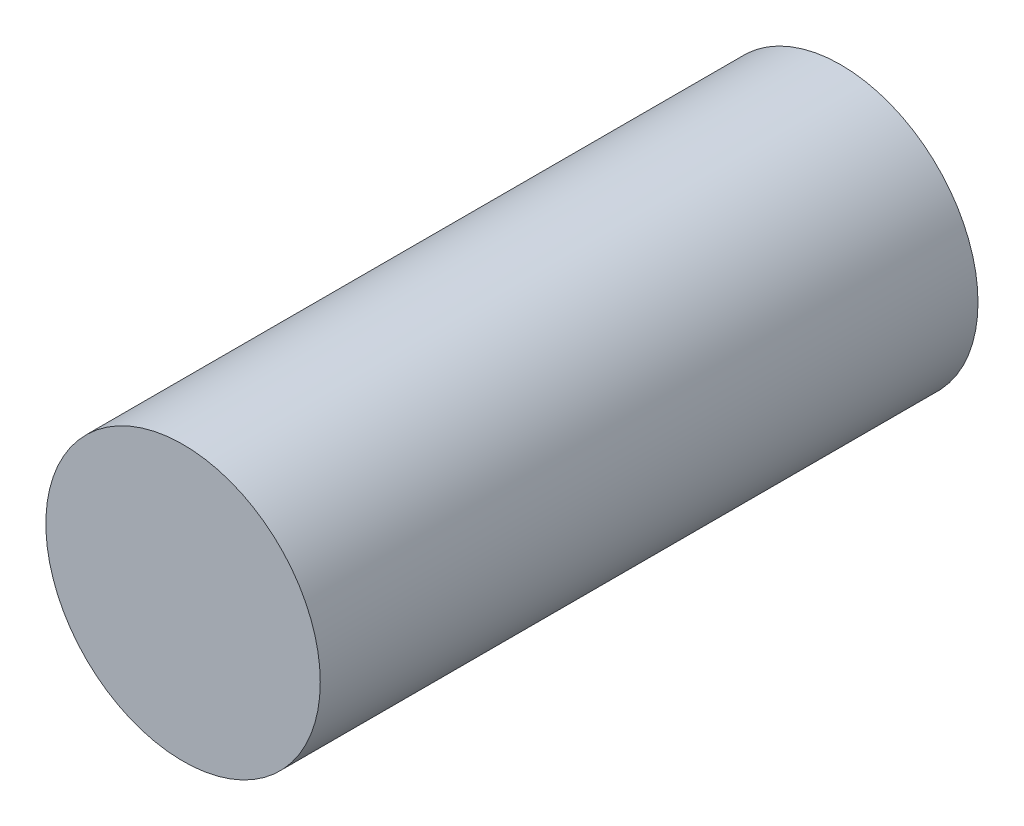
ISO-10303-21;
HEADER;
FILE_DESCRIPTION(('STEP AP214'),'2;1');
FILE_NAME('part.step','',(''),(''),'','','');
FILE_SCHEMA(('AUTOMOTIVE_DESIGN { 1 0 10303 214 1 1 1 1 }'));
ENDSEC;
DATA;
#1=APPLICATION_CONTEXT('core data for automotive mechanical design processes');
#2=APPLICATION_PROTOCOL_DEFINITION('international standard','automotive_design',2000,#1);
#3=PRODUCT_CONTEXT('',#1,'mechanical');
#4=PRODUCT('Part','Part','',(#3));
#5=PRODUCT_RELATED_PRODUCT_CATEGORY('part','',(#4));
#6=PRODUCT_DEFINITION_FORMATION('','',#4);
#7=PRODUCT_DEFINITION_CONTEXT('part definition',#1,'design');
#8=PRODUCT_DEFINITION('design','',#6,#7);
#9=PRODUCT_DEFINITION_SHAPE('','',#8);
#10=(LENGTH_UNIT() NAMED_UNIT(*) SI_UNIT(.MILLI.,.METRE.));
#11=(NAMED_UNIT(*) PLANE_ANGLE_UNIT() SI_UNIT($,.RADIAN.));
#12=(NAMED_UNIT(*) SI_UNIT($,.STERADIAN.) SOLID_ANGLE_UNIT());
#13=UNCERTAINTY_MEASURE_WITH_UNIT(LENGTH_MEASURE(1.E-05),#10,'distance_accuracy_value','');
#14=(GEOMETRIC_REPRESENTATION_CONTEXT(3) GLOBAL_UNCERTAINTY_ASSIGNED_CONTEXT((#13)) GLOBAL_UNIT_ASSIGNED_CONTEXT((#10,
#11,#12)) REPRESENTATION_CONTEXT('',''));
#15=CARTESIAN_POINT('',(0.,0.,0.));
#16=DIRECTION('',(0.,0.,1.));
#17=DIRECTION('',(1.,0.,0.));
#18=AXIS2_PLACEMENT_3D('',#15,#16,#17);
#19=CARTESIAN_POINT('',(46.6889090394125,270.,-19.1740073060914));
#20=DIRECTION('',(0.,0.,-1.));
#21=DIRECTION('',(0.,-1.,0.));
#22=AXIS2_PLACEMENT_3D('',#19,#20,#21);
#23=PLANE('',#22);
#24=CARTESIAN_POINT('',(57.0736440848851,292.857154945688,-19.1740073060914));
#25=DIRECTION('',(0.,0.,-1.));
#26=DIRECTION('',(0.,1.,0.));
#27=AXIS2_PLACEMENT_3D('',#24,#25,#26);
#28=CIRCLE('',#27,4.00000000000001);
#29=CARTESIAN_POINT('',(57.0736440848851,296.857154945688,-19.1740073060914));
#30=VERTEX_POINT('',#29);
#31=EDGE_CURVE('E10',#30,#30,#28,.F.);
#32=ORIENTED_EDGE('',*,*,#31,.F.);
#33=EDGE_LOOP('',(#32));
#34=FACE_BOUND('',#33,.T.);
#35=ADVANCED_FACE('F37',(#34),#23,.T.);
#36=CARTESIAN_POINT('',(57.0736440848851,292.857154945688,0.));
#37=DIRECTION('',(0.,0.,1.));
#38=DIRECTION('',(1.,0.,0.));
#39=AXIS2_PLACEMENT_3D('',#36,#37,#38);
#40=PLANE('',#39);
#41=CARTESIAN_POINT('',(57.0736440848851,292.857154945688,0.));
#42=DIRECTION('',(0.,0.,1.));
#43=DIRECTION('',(1.,0.,0.));
#44=AXIS2_PLACEMENT_3D('',#41,#42,#43);
#45=CIRCLE('',#44,4.00000000000001);
#46=CARTESIAN_POINT('',(61.0736440848851,292.857154945688,0.));
#47=VERTEX_POINT('',#46);
#48=EDGE_CURVE('E43',#47,#47,#45,.T.);
#49=ORIENTED_EDGE('',*,*,#48,.T.);
#50=EDGE_LOOP('',(#49));
#51=FACE_BOUND('',#50,.T.);
#52=ADVANCED_FACE('F49',(#51),#40,.T.);
#53=CARTESIAN_POINT('',(57.0736440848851,292.857154945688,-30.4877158050762));
#54=DIRECTION('',(0.,0.,1.));
#55=DIRECTION('',(1.,0.,0.));
#56=AXIS2_PLACEMENT_3D('',#53,#54,#55);
#57=CYLINDRICAL_SURFACE('',#56,4.00000000000001);
#58=ORIENTED_EDGE('',*,*,#48,.F.);
#59=EDGE_LOOP('',(#58));
#60=FACE_BOUND('',#59,.T.);
#61=ORIENTED_EDGE('',*,*,#31,.T.);
#62=EDGE_LOOP('',(#61));
#63=FACE_BOUND('',#62,.T.);
#64=ADVANCED_FACE('F51',(#60,#63),#57,.T.);
#65=CLOSED_SHELL('',(#35,#52,#64));
#66=MANIFOLD_SOLID_BREP('B2',#65);
#67=ADVANCED_BREP_SHAPE_REPRESENTATION('',(#18,#66),#14);
#68=SHAPE_DEFINITION_REPRESENTATION(#9,#67);
ENDSEC;
END-ISO-10303-21;
